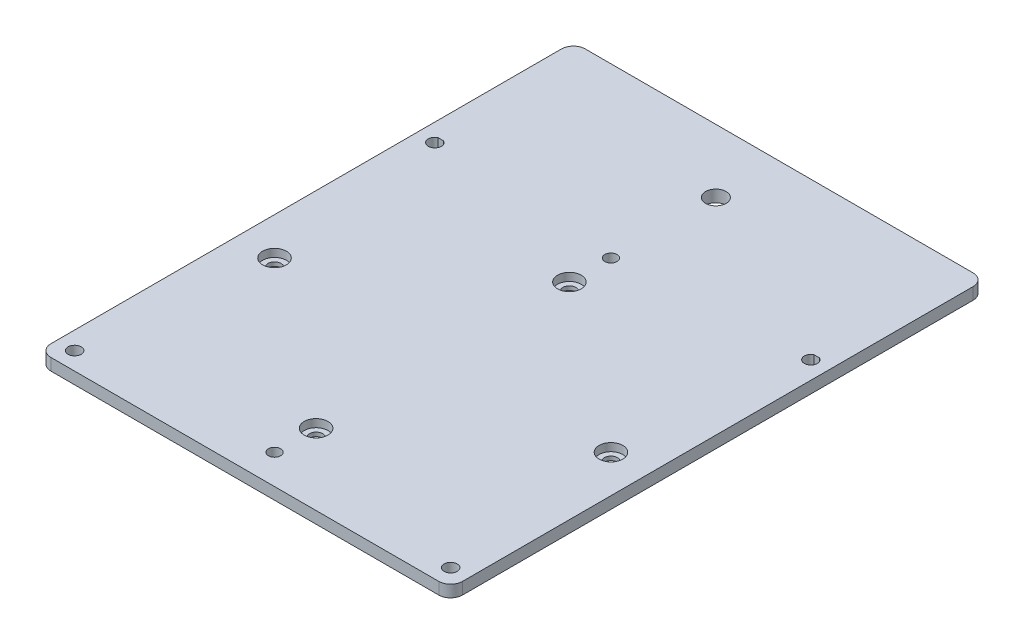
ISO-10303-21;
HEADER;
FILE_DESCRIPTION(('STEP AP214'),'2;1');
FILE_NAME('part.step','',(''),(''),'','','');
FILE_SCHEMA(('AUTOMOTIVE_DESIGN { 1 0 10303 214 1 1 1 1 }'));
ENDSEC;
DATA;
#1=APPLICATION_CONTEXT('core data for automotive mechanical design processes');
#2=APPLICATION_PROTOCOL_DEFINITION('international standard','automotive_design',2000,#1);
#3=PRODUCT_CONTEXT('',#1,'mechanical');
#4=PRODUCT('Part','Part','',(#3));
#5=PRODUCT_RELATED_PRODUCT_CATEGORY('part','',(#4));
#6=PRODUCT_DEFINITION_FORMATION('','',#4);
#7=PRODUCT_DEFINITION_CONTEXT('part definition',#1,'design');
#8=PRODUCT_DEFINITION('design','',#6,#7);
#9=PRODUCT_DEFINITION_SHAPE('','',#8);
#10=(LENGTH_UNIT() NAMED_UNIT(*) SI_UNIT(.MILLI.,.METRE.));
#11=(NAMED_UNIT(*) PLANE_ANGLE_UNIT() SI_UNIT($,.RADIAN.));
#12=(NAMED_UNIT(*) SI_UNIT($,.STERADIAN.) SOLID_ANGLE_UNIT());
#13=UNCERTAINTY_MEASURE_WITH_UNIT(LENGTH_MEASURE(1.E-05),#10,'distance_accuracy_value','');
#14=(GEOMETRIC_REPRESENTATION_CONTEXT(3) GLOBAL_UNCERTAINTY_ASSIGNED_CONTEXT((#13)) GLOBAL_UNIT_ASSIGNED_CONTEXT((#10,
#11,#12)) REPRESENTATION_CONTEXT('',''));
#15=CARTESIAN_POINT('',(0.,0.,0.));
#16=DIRECTION('',(0.,0.,1.));
#17=DIRECTION('',(1.,0.,0.));
#18=AXIS2_PLACEMENT_3D('',#15,#16,#17);
#19=CARTESIAN_POINT('',(0.,3.,100.));
#20=DIRECTION('',(-1.,0.,0.));
#21=DIRECTION('',(0.,0.,1.));
#22=AXIS2_PLACEMENT_3D('',#19,#20,#21);
#23=PLANE('',#22);
#24=DIRECTION('',(0.,0.,-1.));
#25=VECTOR('',#24,1.);
#26=CARTESIAN_POINT('',(0.,3.,100.));
#27=LINE('',#26,#25);
#28=CARTESIAN_POINT('',(0.,3.,97.));
#29=VERTEX_POINT('',#28);
#30=CARTESIAN_POINT('',(0.,3.,-32.));
#31=VERTEX_POINT('',#30);
#32=EDGE_CURVE('E172',#29,#31,#27,.T.);
#33=ORIENTED_EDGE('',*,*,#32,.T.);
#34=DIRECTION('',(0.,1.,0.));
#35=VECTOR('',#34,1.);
#36=CARTESIAN_POINT('',(0.,3.,-32.));
#37=LINE('',#36,#35);
#38=CARTESIAN_POINT('',(0.,0.,-32.));
#39=VERTEX_POINT('',#38);
#40=EDGE_CURVE('E11',#31,#39,#37,.F.);
#41=ORIENTED_EDGE('',*,*,#40,.T.);
#42=DIRECTION('',(0.,0.,-1.));
#43=VECTOR('',#42,1.);
#44=CARTESIAN_POINT('',(0.,0.,100.));
#45=LINE('',#44,#43);
#46=CARTESIAN_POINT('',(0.,0.,97.));
#47=VERTEX_POINT('',#46);
#48=EDGE_CURVE('E171',#47,#39,#45,.T.);
#49=ORIENTED_EDGE('',*,*,#48,.F.);
#50=DIRECTION('',(0.,-1.,0.));
#51=VECTOR('',#50,1.);
#52=CARTESIAN_POINT('',(0.,3.,97.));
#53=LINE('',#52,#51);
#54=EDGE_CURVE('E202',#47,#29,#53,.F.);
#55=ORIENTED_EDGE('',*,*,#54,.T.);
#56=EDGE_LOOP('',(#33,#41,#49,#55));
#57=FACE_BOUND('',#56,.T.);
#58=ADVANCED_FACE('F33',(#57),#23,.T.);
#59=CARTESIAN_POINT('',(104.,3.,100.));
#60=DIRECTION('',(0.,0.,1.));
#61=DIRECTION('',(1.,0.,0.));
#62=AXIS2_PLACEMENT_3D('',#59,#60,#61);
#63=PLANE('',#62);
#64=DIRECTION('',(-1.,0.,0.));
#65=VECTOR('',#64,1.);
#66=CARTESIAN_POINT('',(104.,0.,100.));
#67=LINE('',#66,#65);
#68=CARTESIAN_POINT('',(101.,0.,100.));
#69=VERTEX_POINT('',#68);
#70=CARTESIAN_POINT('',(3.00000000000004,0.,100.));
#71=VERTEX_POINT('',#70);
#72=EDGE_CURVE('E175',#69,#71,#67,.T.);
#73=ORIENTED_EDGE('',*,*,#72,.F.);
#74=DIRECTION('',(0.,-1.,0.));
#75=VECTOR('',#74,1.);
#76=CARTESIAN_POINT('',(101.,3.,100.));
#77=LINE('',#76,#75);
#78=CARTESIAN_POINT('',(101.,3.,100.));
#79=VERTEX_POINT('',#78);
#80=EDGE_CURVE('E200',#69,#79,#77,.F.);
#81=ORIENTED_EDGE('',*,*,#80,.T.);
#82=DIRECTION('',(-1.,0.,0.));
#83=VECTOR('',#82,1.);
#84=CARTESIAN_POINT('',(104.,3.,100.));
#85=LINE('',#84,#83);
#86=CARTESIAN_POINT('',(3.00000000000004,3.,100.));
#87=VERTEX_POINT('',#86);
#88=EDGE_CURVE('E177',#79,#87,#85,.T.);
#89=ORIENTED_EDGE('',*,*,#88,.T.);
#90=DIRECTION('',(0.,-1.,0.));
#91=VECTOR('',#90,1.);
#92=CARTESIAN_POINT('',(3.00000000000002,3.,100.));
#93=LINE('',#92,#91);
#94=EDGE_CURVE('E197',#87,#71,#93,.T.);
#95=ORIENTED_EDGE('',*,*,#94,.T.);
#96=EDGE_LOOP('',(#73,#81,#89,#95));
#97=FACE_BOUND('',#96,.T.);
#98=ADVANCED_FACE('F334',(#97),#63,.T.);
#99=CARTESIAN_POINT('',(104.,3.,0.));
#100=DIRECTION('',(1.,0.,0.));
#101=DIRECTION('',(0.,0.,-1.));
#102=AXIS2_PLACEMENT_3D('',#99,#100,#101);
#103=PLANE('',#102);
#104=DIRECTION('',(0.,0.,1.));
#105=VECTOR('',#104,1.);
#106=CARTESIAN_POINT('',(104.,0.,0.));
#107=LINE('',#106,#105);
#108=CARTESIAN_POINT('',(104.,0.,-32.));
#109=VERTEX_POINT('',#108);
#110=CARTESIAN_POINT('',(104.,0.,97.));
#111=VERTEX_POINT('',#110);
#112=EDGE_CURVE('E182',#109,#111,#107,.T.);
#113=ORIENTED_EDGE('',*,*,#112,.F.);
#114=DIRECTION('',(0.,1.,0.));
#115=VECTOR('',#114,1.);
#116=CARTESIAN_POINT('',(104.,3.,-32.));
#117=LINE('',#116,#115);
#118=CARTESIAN_POINT('',(104.,3.,-32.));
#119=VERTEX_POINT('',#118);
#120=EDGE_CURVE('E204',#109,#119,#117,.T.);
#121=ORIENTED_EDGE('',*,*,#120,.T.);
#122=DIRECTION('',(0.,0.,1.));
#123=VECTOR('',#122,1.);
#124=CARTESIAN_POINT('',(104.,3.,0.));
#125=LINE('',#124,#123);
#126=CARTESIAN_POINT('',(104.,3.,97.));
#127=VERTEX_POINT('',#126);
#128=EDGE_CURVE('E174',#119,#127,#125,.T.);
#129=ORIENTED_EDGE('',*,*,#128,.T.);
#130=DIRECTION('',(0.,-1.,0.));
#131=VECTOR('',#130,1.);
#132=CARTESIAN_POINT('',(104.,3.,97.));
#133=LINE('',#132,#131);
#134=EDGE_CURVE('E189',#127,#111,#133,.T.);
#135=ORIENTED_EDGE('',*,*,#134,.T.);
#136=EDGE_LOOP('',(#113,#121,#129,#135));
#137=FACE_BOUND('',#136,.T.);
#138=ADVANCED_FACE('F224',(#137),#103,.T.);
#139=CARTESIAN_POINT('',(0.,3.,0.));
#140=DIRECTION('',(0.,-1.,0.));
#141=DIRECTION('',(0.,0.,-1.));
#142=AXIS2_PLACEMENT_3D('',#139,#140,#141);
#143=PLANE('',#142);
#144=CARTESIAN_POINT('',(52.,3.,-19.));
#145=DIRECTION('',(0.,1.,0.));
#146=DIRECTION('',(0.,0.,1.));
#147=AXIS2_PLACEMENT_3D('',#144,#145,#146);
#148=CIRCLE('',#147,2.6);
#149=CARTESIAN_POINT('',(52.,3.,-16.4));
#150=VERTEX_POINT('',#149);
#151=EDGE_CURVE('E241',#150,#150,#148,.T.);
#152=ORIENTED_EDGE('',*,*,#151,.F.);
#153=EDGE_LOOP('',(#152));
#154=FACE_BOUND('',#153,.T.);
#155=DIRECTION('',(1.,0.,0.));
#156=VECTOR('',#155,1.);
#157=CARTESIAN_POINT('',(0.,3.,3.));
#158=LINE('',#157,#156);
#159=CARTESIAN_POINT('',(98.8126136457566,3.,3.));
#160=VERTEX_POINT('',#159);
#161=CARTESIAN_POINT('',(100.187386354243,3.,3.));
#162=VERTEX_POINT('',#161);
#163=EDGE_CURVE('E238',#160,#162,#158,.T.);
#164=ORIENTED_EDGE('',*,*,#163,.T.);
#165=CARTESIAN_POINT('',(99.5,3.,4.5));
#166=DIRECTION('',(0.,-1.,0.));
#167=DIRECTION('',(0.,0.,-1.));
#168=AXIS2_PLACEMENT_3D('',#165,#166,#167);
#169=CIRCLE('',#168,1.64999999999998);
#170=EDGE_CURVE('E156',#162,#160,#169,.T.);
#171=ORIENTED_EDGE('',*,*,#170,.T.);
#172=EDGE_LOOP('',(#164,#171));
#173=FACE_BOUND('',#172,.T.);
#174=CARTESIAN_POINT('',(3.81261364575665,3.,3.));
#175=VERTEX_POINT('',#174);
#176=CARTESIAN_POINT('',(5.18738635424335,3.,3.));
#177=VERTEX_POINT('',#176);
#178=EDGE_CURVE('E128',#175,#177,#158,.T.);
#179=ORIENTED_EDGE('',*,*,#178,.T.);
#180=CARTESIAN_POINT('',(4.5,3.,4.5));
#181=DIRECTION('',(0.,-1.,0.));
#182=DIRECTION('',(0.,0.,-1.));
#183=AXIS2_PLACEMENT_3D('',#180,#181,#182);
#184=CIRCLE('',#183,1.64999999999999);
#185=EDGE_CURVE('E144',#177,#175,#184,.T.);
#186=ORIENTED_EDGE('',*,*,#185,.T.);
#187=EDGE_LOOP('',(#179,#186));
#188=FACE_BOUND('',#187,.T.);
#189=CARTESIAN_POINT('',(52.,3.,7.5));
#190=DIRECTION('',(0.,1.,0.));
#191=DIRECTION('',(0.,0.,1.));
#192=AXIS2_PLACEMENT_3D('',#189,#190,#191);
#193=CIRCLE('',#192,1.55);
#194=CARTESIAN_POINT('',(52.,3.,9.05));
#195=VERTEX_POINT('',#194);
#196=EDGE_CURVE('E258',#195,#195,#193,.T.);
#197=ORIENTED_EDGE('',*,*,#196,.F.);
#198=EDGE_LOOP('',(#197));
#199=FACE_BOUND('',#198,.T.);
#200=CARTESIAN_POINT('',(52.,3.,92.5));
#201=DIRECTION('',(0.,1.,0.));
#202=DIRECTION('',(0.,0.,-1.));
#203=AXIS2_PLACEMENT_3D('',#200,#201,#202);
#204=CIRCLE('',#203,1.55);
#205=CARTESIAN_POINT('',(52.,3.,90.95));
#206=VERTEX_POINT('',#205);
#207=EDGE_CURVE('E253',#206,#206,#204,.T.);
#208=ORIENTED_EDGE('',*,*,#207,.F.);
#209=EDGE_LOOP('',(#208));
#210=FACE_BOUND('',#209,.T.);
#211=CARTESIAN_POINT('',(52.,3.,18.));
#212=DIRECTION('',(0.,1.,0.));
#213=DIRECTION('',(0.,0.,1.));
#214=AXIS2_PLACEMENT_3D('',#211,#212,#213);
#215=CIRCLE('',#214,3.);
#216=CARTESIAN_POINT('',(52.,3.,21.));
#217=VERTEX_POINT('',#216);
#218=EDGE_CURVE('E257',#217,#217,#215,.T.);
#219=ORIENTED_EDGE('',*,*,#218,.F.);
#220=EDGE_LOOP('',(#219));
#221=FACE_BOUND('',#220,.T.);
#222=CARTESIAN_POINT('',(94.5,3.,50.));
#223=DIRECTION('',(0.,1.,0.));
#224=DIRECTION('',(0.,0.,1.));
#225=AXIS2_PLACEMENT_3D('',#222,#223,#224);
#226=CIRCLE('',#225,2.99999999999999);
#227=CARTESIAN_POINT('',(94.5,3.,53.));
#228=VERTEX_POINT('',#227);
#229=EDGE_CURVE('E277',#228,#228,#226,.T.);
#230=ORIENTED_EDGE('',*,*,#229,.F.);
#231=EDGE_LOOP('',(#230));
#232=FACE_BOUND('',#231,.T.);
#233=CARTESIAN_POINT('',(9.5,3.,50.));
#234=DIRECTION('',(0.,1.,0.));
#235=DIRECTION('',(0.,0.,1.));
#236=AXIS2_PLACEMENT_3D('',#233,#234,#235);
#237=CIRCLE('',#236,2.99999999999999);
#238=CARTESIAN_POINT('',(9.5,3.,53.));
#239=VERTEX_POINT('',#238);
#240=EDGE_CURVE('E289',#239,#239,#237,.T.);
#241=ORIENTED_EDGE('',*,*,#240,.F.);
#242=EDGE_LOOP('',(#241));
#243=FACE_BOUND('',#242,.T.);
#244=CARTESIAN_POINT('',(52.,3.,82.));
#245=DIRECTION('',(0.,1.,0.));
#246=DIRECTION('',(0.,0.,1.));
#247=AXIS2_PLACEMENT_3D('',#244,#245,#246);
#248=CIRCLE('',#247,3.);
#249=CARTESIAN_POINT('',(52.,3.,85.));
#250=VERTEX_POINT('',#249);
#251=EDGE_CURVE('E301',#250,#250,#248,.T.);
#252=ORIENTED_EDGE('',*,*,#251,.F.);
#253=EDGE_LOOP('',(#252));
#254=FACE_BOUND('',#253,.T.);
#255=ORIENTED_EDGE('',*,*,#128,.F.);
#256=CARTESIAN_POINT('',(101.,3.,-32.));
#257=DIRECTION('',(0.,-1.,0.));
#258=DIRECTION('',(0.,0.,-1.));
#259=AXIS2_PLACEMENT_3D('',#256,#257,#258);
#260=CIRCLE('',#259,3.);
#261=CARTESIAN_POINT('',(101.,3.,-35.));
#262=VERTEX_POINT('',#261);
#263=EDGE_CURVE('E209',#119,#262,#260,.F.);
#264=ORIENTED_EDGE('',*,*,#263,.T.);
#265=DIRECTION('',(-1.,0.,0.));
#266=VECTOR('',#265,1.);
#267=CARTESIAN_POINT('',(0.,3.,-35.));
#268=LINE('',#267,#266);
#269=CARTESIAN_POINT('',(2.99999999999999,3.,-35.));
#270=VERTEX_POINT('',#269);
#271=EDGE_CURVE('E233',#262,#270,#268,.T.);
#272=ORIENTED_EDGE('',*,*,#271,.T.);
#273=CARTESIAN_POINT('',(3.,3.,-32.));
#274=DIRECTION('',(0.,-1.,0.));
#275=DIRECTION('',(0.,0.,-1.));
#276=AXIS2_PLACEMENT_3D('',#273,#274,#275);
#277=CIRCLE('',#276,3.);
#278=EDGE_CURVE('E207',#270,#31,#277,.F.);
#279=ORIENTED_EDGE('',*,*,#278,.T.);
#280=ORIENTED_EDGE('',*,*,#32,.F.);
#281=CARTESIAN_POINT('',(3.00000000000002,3.,97.));
#282=DIRECTION('',(0.,-1.,0.));
#283=DIRECTION('',(0.,0.,-1.));
#284=AXIS2_PLACEMENT_3D('',#281,#282,#283);
#285=CIRCLE('',#284,3.);
#286=EDGE_CURVE('E192',#29,#87,#285,.F.);
#287=ORIENTED_EDGE('',*,*,#286,.T.);
#288=ORIENTED_EDGE('',*,*,#88,.F.);
#289=CARTESIAN_POINT('',(101.,3.,97.));
#290=DIRECTION('',(0.,-1.,0.));
#291=DIRECTION('',(0.,0.,-1.));
#292=AXIS2_PLACEMENT_3D('',#289,#290,#291);
#293=CIRCLE('',#292,3.);
#294=EDGE_CURVE('E194',#79,#127,#293,.F.);
#295=ORIENTED_EDGE('',*,*,#294,.T.);
#296=EDGE_LOOP('',(#255,#264,#272,#279,#280,#287,#288,#295));
#297=FACE_BOUND('',#296,.T.);
#298=CARTESIAN_POINT('',(99.5,3.,95.5));
#299=DIRECTION('',(0.,-1.,0.));
#300=DIRECTION('',(0.,0.,-1.));
#301=AXIS2_PLACEMENT_3D('',#298,#299,#300);
#302=CIRCLE('',#301,1.64999999999998);
#303=CARTESIAN_POINT('',(99.5,3.,93.85));
#304=VERTEX_POINT('',#303);
#305=EDGE_CURVE('E162',#304,#304,#302,.T.);
#306=ORIENTED_EDGE('',*,*,#305,.T.);
#307=EDGE_LOOP('',(#306));
#308=FACE_BOUND('',#307,.T.);
#309=CARTESIAN_POINT('',(4.5,3.,95.5));
#310=DIRECTION('',(0.,-1.,0.));
#311=DIRECTION('',(0.,0.,-1.));
#312=AXIS2_PLACEMENT_3D('',#309,#310,#311);
#313=CIRCLE('',#312,1.64999999999999);
#314=CARTESIAN_POINT('',(4.5,3.,93.85));
#315=VERTEX_POINT('',#314);
#316=EDGE_CURVE('E168',#315,#315,#313,.T.);
#317=ORIENTED_EDGE('',*,*,#316,.T.);
#318=EDGE_LOOP('',(#317));
#319=FACE_BOUND('',#318,.T.);
#320=ADVANCED_FACE('F231',(#154,#173,#188,#199,#210,#221,#232,#243,#254,#297,#308,#319),#143,.F.);
#321=CARTESIAN_POINT('',(0.,0.,0.));
#322=DIRECTION('',(0.,-1.,0.));
#323=DIRECTION('',(0.,0.,-1.));
#324=AXIS2_PLACEMENT_3D('',#321,#322,#323);
#325=PLANE('',#324);
#326=CARTESIAN_POINT('',(52.,0.,-19.));
#327=DIRECTION('',(0.,1.,0.));
#328=DIRECTION('',(0.,0.,1.));
#329=AXIS2_PLACEMENT_3D('',#326,#327,#328);
#330=CIRCLE('',#329,2.6);
#331=CARTESIAN_POINT('',(52.,0.,-16.4));
#332=VERTEX_POINT('',#331);
#333=EDGE_CURVE('E244',#332,#332,#330,.T.);
#334=ORIENTED_EDGE('',*,*,#333,.T.);
#335=EDGE_LOOP('',(#334));
#336=FACE_BOUND('',#335,.T.);
#337=CARTESIAN_POINT('',(99.5,0.,4.5));
#338=DIRECTION('',(0.,-1.,0.));
#339=DIRECTION('',(0.,0.,-1.));
#340=AXIS2_PLACEMENT_3D('',#337,#338,#339);
#341=CIRCLE('',#340,1.64999999999998);
#342=CARTESIAN_POINT('',(100.187386354243,0.,3.));
#343=VERTEX_POINT('',#342);
#344=CARTESIAN_POINT('',(98.8126136457567,0.,3.));
#345=VERTEX_POINT('',#344);
#346=EDGE_CURVE('E147',#343,#345,#341,.T.);
#347=ORIENTED_EDGE('',*,*,#346,.F.);
#348=DIRECTION('',(1.,0.,0.));
#349=VECTOR('',#348,1.);
#350=CARTESIAN_POINT('',(0.,0.,3.));
#351=LINE('',#350,#349);
#352=EDGE_CURVE('E141',#345,#343,#351,.T.);
#353=ORIENTED_EDGE('',*,*,#352,.F.);
#354=EDGE_LOOP('',(#347,#353));
#355=FACE_BOUND('',#354,.T.);
#356=CARTESIAN_POINT('',(4.5,0.,4.5));
#357=DIRECTION('',(0.,-1.,0.));
#358=DIRECTION('',(0.,0.,-1.));
#359=AXIS2_PLACEMENT_3D('',#356,#357,#358);
#360=CIRCLE('',#359,1.64999999999999);
#361=CARTESIAN_POINT('',(5.18738635424335,0.,3.));
#362=VERTEX_POINT('',#361);
#363=CARTESIAN_POINT('',(3.81261364575665,0.,3.));
#364=VERTEX_POINT('',#363);
#365=EDGE_CURVE('E139',#362,#364,#360,.T.);
#366=ORIENTED_EDGE('',*,*,#365,.F.);
#367=EDGE_CURVE('E125',#364,#362,#351,.T.);
#368=ORIENTED_EDGE('',*,*,#367,.F.);
#369=EDGE_LOOP('',(#366,#368));
#370=FACE_BOUND('',#369,.T.);
#371=DIRECTION('',(-1.,0.,0.));
#372=VECTOR('',#371,1.);
#373=CARTESIAN_POINT('',(0.,0.,-35.));
#374=LINE('',#373,#372);
#375=CARTESIAN_POINT('',(101.,0.,-35.));
#376=VERTEX_POINT('',#375);
#377=CARTESIAN_POINT('',(3.,0.,-35.));
#378=VERTEX_POINT('',#377);
#379=EDGE_CURVE('E140',#376,#378,#374,.T.);
#380=ORIENTED_EDGE('',*,*,#379,.F.);
#381=CARTESIAN_POINT('',(101.,0.,-32.));
#382=DIRECTION('',(0.,-1.,0.));
#383=DIRECTION('',(0.,0.,-1.));
#384=AXIS2_PLACEMENT_3D('',#381,#382,#383);
#385=CIRCLE('',#384,3.);
#386=EDGE_CURVE('E41',#376,#109,#385,.T.);
#387=ORIENTED_EDGE('',*,*,#386,.T.);
#388=ORIENTED_EDGE('',*,*,#112,.T.);
#389=CARTESIAN_POINT('',(101.,0.,97.));
#390=DIRECTION('',(0.,-1.,0.));
#391=DIRECTION('',(0.,0.,-1.));
#392=AXIS2_PLACEMENT_3D('',#389,#390,#391);
#393=CIRCLE('',#392,3.);
#394=EDGE_CURVE('E187',#111,#69,#393,.T.);
#395=ORIENTED_EDGE('',*,*,#394,.T.);
#396=ORIENTED_EDGE('',*,*,#72,.T.);
#397=CARTESIAN_POINT('',(3.00000000000002,0.,97.));
#398=DIRECTION('',(0.,-1.,0.));
#399=DIRECTION('',(0.,0.,-1.));
#400=AXIS2_PLACEMENT_3D('',#397,#398,#399);
#401=CIRCLE('',#400,3.);
#402=EDGE_CURVE('E180',#71,#47,#401,.T.);
#403=ORIENTED_EDGE('',*,*,#402,.T.);
#404=ORIENTED_EDGE('',*,*,#48,.T.);
#405=CARTESIAN_POINT('',(3.,0.,-32.));
#406=DIRECTION('',(0.,-1.,0.));
#407=DIRECTION('',(0.,0.,-1.));
#408=AXIS2_PLACEMENT_3D('',#405,#406,#407);
#409=CIRCLE('',#408,3.);
#410=EDGE_CURVE('E53',#39,#378,#409,.T.);
#411=ORIENTED_EDGE('',*,*,#410,.T.);
#412=EDGE_LOOP('',(#380,#387,#388,#395,#396,#403,#404,#411));
#413=FACE_BOUND('',#412,.T.);
#414=CARTESIAN_POINT('',(52.,0.,7.5));
#415=DIRECTION('',(0.,1.,0.));
#416=DIRECTION('',(0.,0.,1.));
#417=AXIS2_PLACEMENT_3D('',#414,#415,#416);
#418=CIRCLE('',#417,1.55);
#419=CARTESIAN_POINT('',(52.,0.,9.05));
#420=VERTEX_POINT('',#419);
#421=EDGE_CURVE('E254',#420,#420,#418,.T.);
#422=ORIENTED_EDGE('',*,*,#421,.T.);
#423=EDGE_LOOP('',(#422));
#424=FACE_BOUND('',#423,.T.);
#425=CARTESIAN_POINT('',(52.,0.,92.5));
#426=DIRECTION('',(0.,1.,0.));
#427=DIRECTION('',(0.,0.,-1.));
#428=AXIS2_PLACEMENT_3D('',#425,#426,#427);
#429=CIRCLE('',#428,1.55);
#430=CARTESIAN_POINT('',(52.,0.,90.95));
#431=VERTEX_POINT('',#430);
#432=EDGE_CURVE('E261',#431,#431,#429,.T.);
#433=ORIENTED_EDGE('',*,*,#432,.T.);
#434=EDGE_LOOP('',(#433));
#435=FACE_BOUND('',#434,.T.);
#436=CARTESIAN_POINT('',(52.,0.,18.));
#437=DIRECTION('',(0.,1.,0.));
#438=DIRECTION('',(0.,0.,1.));
#439=AXIS2_PLACEMENT_3D('',#436,#437,#438);
#440=CIRCLE('',#439,1.65000000000001);
#441=CARTESIAN_POINT('',(52.,0.,19.65));
#442=VERTEX_POINT('',#441);
#443=EDGE_CURVE('E274',#442,#442,#440,.T.);
#444=ORIENTED_EDGE('',*,*,#443,.T.);
#445=EDGE_LOOP('',(#444));
#446=FACE_BOUND('',#445,.T.);
#447=CARTESIAN_POINT('',(94.5,0.,50.));
#448=DIRECTION('',(0.,1.,0.));
#449=DIRECTION('',(0.,0.,1.));
#450=AXIS2_PLACEMENT_3D('',#447,#448,#449);
#451=CIRCLE('',#450,1.65000000000001);
#452=CARTESIAN_POINT('',(94.5,0.,51.65));
#453=VERTEX_POINT('',#452);
#454=EDGE_CURVE('E286',#453,#453,#451,.T.);
#455=ORIENTED_EDGE('',*,*,#454,.T.);
#456=EDGE_LOOP('',(#455));
#457=FACE_BOUND('',#456,.T.);
#458=CARTESIAN_POINT('',(9.5,0.,50.));
#459=DIRECTION('',(0.,1.,0.));
#460=DIRECTION('',(0.,0.,1.));
#461=AXIS2_PLACEMENT_3D('',#458,#459,#460);
#462=CIRCLE('',#461,1.65000000000001);
#463=CARTESIAN_POINT('',(9.5,0.,51.65));
#464=VERTEX_POINT('',#463);
#465=EDGE_CURVE('E298',#464,#464,#462,.T.);
#466=ORIENTED_EDGE('',*,*,#465,.T.);
#467=EDGE_LOOP('',(#466));
#468=FACE_BOUND('',#467,.T.);
#469=CARTESIAN_POINT('',(52.,0.,82.));
#470=DIRECTION('',(0.,1.,0.));
#471=DIRECTION('',(0.,0.,1.));
#472=AXIS2_PLACEMENT_3D('',#469,#470,#471);
#473=CIRCLE('',#472,1.65000000000001);
#474=CARTESIAN_POINT('',(52.,0.,83.65));
#475=VERTEX_POINT('',#474);
#476=EDGE_CURVE('E145',#475,#475,#473,.T.);
#477=ORIENTED_EDGE('',*,*,#476,.T.);
#478=EDGE_LOOP('',(#477));
#479=FACE_BOUND('',#478,.T.);
#480=CARTESIAN_POINT('',(99.5,0.,95.5));
#481=DIRECTION('',(0.,-1.,0.));
#482=DIRECTION('',(0.,0.,-1.));
#483=AXIS2_PLACEMENT_3D('',#480,#481,#482);
#484=CIRCLE('',#483,1.64999999999998);
#485=CARTESIAN_POINT('',(99.5,0.,93.85));
#486=VERTEX_POINT('',#485);
#487=EDGE_CURVE('E159',#486,#486,#484,.T.);
#488=ORIENTED_EDGE('',*,*,#487,.F.);
#489=EDGE_LOOP('',(#488));
#490=FACE_BOUND('',#489,.T.);
#491=CARTESIAN_POINT('',(4.5,0.,95.5));
#492=DIRECTION('',(0.,-1.,0.));
#493=DIRECTION('',(0.,0.,-1.));
#494=AXIS2_PLACEMENT_3D('',#491,#492,#493);
#495=CIRCLE('',#494,1.64999999999999);
#496=CARTESIAN_POINT('',(4.5,0.,93.85));
#497=VERTEX_POINT('',#496);
#498=EDGE_CURVE('E165',#497,#497,#495,.T.);
#499=ORIENTED_EDGE('',*,*,#498,.F.);
#500=EDGE_LOOP('',(#499));
#501=FACE_BOUND('',#500,.T.);
#502=ADVANCED_FACE('F138',(#336,#355,#370,#413,#424,#435,#446,#457,#468,#479,#490,#501),#325,.T.);
#503=CARTESIAN_POINT('',(4.5,0.,95.5));
#504=DIRECTION('',(0.,-1.,0.));
#505=DIRECTION('',(0.,0.,-1.));
#506=AXIS2_PLACEMENT_3D('',#503,#504,#505);
#507=CYLINDRICAL_SURFACE('',#506,1.64999999999999);
#508=ORIENTED_EDGE('',*,*,#316,.F.);
#509=EDGE_LOOP('',(#508));
#510=FACE_BOUND('',#509,.T.);
#511=ORIENTED_EDGE('',*,*,#498,.T.);
#512=EDGE_LOOP('',(#511));
#513=FACE_BOUND('',#512,.T.);
#514=ADVANCED_FACE('F331',(#510,#513),#507,.F.);
#515=CARTESIAN_POINT('',(99.5,0.,95.5));
#516=DIRECTION('',(0.,-1.,0.));
#517=DIRECTION('',(0.,0.,-1.));
#518=AXIS2_PLACEMENT_3D('',#515,#516,#517);
#519=CYLINDRICAL_SURFACE('',#518,1.64999999999998);
#520=ORIENTED_EDGE('',*,*,#305,.F.);
#521=EDGE_LOOP('',(#520));
#522=FACE_BOUND('',#521,.T.);
#523=ORIENTED_EDGE('',*,*,#487,.T.);
#524=EDGE_LOOP('',(#523));
#525=FACE_BOUND('',#524,.T.);
#526=ADVANCED_FACE('F425',(#522,#525),#519,.F.);
#527=CARTESIAN_POINT('',(99.5,0.,4.5));
#528=DIRECTION('',(0.,-1.,0.));
#529=DIRECTION('',(0.,0.,-1.));
#530=AXIS2_PLACEMENT_3D('',#527,#528,#529);
#531=CYLINDRICAL_SURFACE('',#530,1.64999999999998);
#532=ORIENTED_EDGE('',*,*,#346,.T.);
#533=DIRECTION('',(0.,-1.,0.));
#534=VECTOR('',#533,1.);
#535=CARTESIAN_POINT('',(98.8126136457567,0.,3.));
#536=LINE('',#535,#534);
#537=EDGE_CURVE('E250',#345,#160,#536,.F.);
#538=ORIENTED_EDGE('',*,*,#537,.T.);
#539=ORIENTED_EDGE('',*,*,#170,.F.);
#540=DIRECTION('',(0.,-1.,0.));
#541=VECTOR('',#540,1.);
#542=CARTESIAN_POINT('',(100.187386354243,0.,3.));
#543=LINE('',#542,#541);
#544=EDGE_CURVE('E133',#162,#343,#543,.T.);
#545=ORIENTED_EDGE('',*,*,#544,.T.);
#546=EDGE_LOOP('',(#532,#538,#539,#545));
#547=FACE_BOUND('',#546,.T.);
#548=ADVANCED_FACE('F422',(#547),#531,.F.);
#549=CARTESIAN_POINT('',(4.5,0.,4.5));
#550=DIRECTION('',(0.,-1.,0.));
#551=DIRECTION('',(0.,0.,-1.));
#552=AXIS2_PLACEMENT_3D('',#549,#550,#551);
#553=CYLINDRICAL_SURFACE('',#552,1.64999999999999);
#554=ORIENTED_EDGE('',*,*,#365,.T.);
#555=DIRECTION('',(0.,-1.,0.));
#556=VECTOR('',#555,1.);
#557=CARTESIAN_POINT('',(3.81261364575665,0.,3.));
#558=LINE('',#557,#556);
#559=EDGE_CURVE('E122',#364,#175,#558,.F.);
#560=ORIENTED_EDGE('',*,*,#559,.T.);
#561=ORIENTED_EDGE('',*,*,#185,.F.);
#562=DIRECTION('',(0.,-1.,0.));
#563=VECTOR('',#562,1.);
#564=CARTESIAN_POINT('',(5.18738635424335,0.,3.));
#565=LINE('',#564,#563);
#566=EDGE_CURVE('E134',#177,#362,#565,.T.);
#567=ORIENTED_EDGE('',*,*,#566,.T.);
#568=EDGE_LOOP('',(#554,#560,#561,#567));
#569=FACE_BOUND('',#568,.T.);
#570=ADVANCED_FACE('F143',(#569),#553,.F.);
#571=CARTESIAN_POINT('',(52.,3.,82.));
#572=DIRECTION('',(0.,1.,0.));
#573=DIRECTION('',(0.,0.,1.));
#574=AXIS2_PLACEMENT_3D('',#571,#572,#573);
#575=CYLINDRICAL_SURFACE('',#574,1.65000000000001);
#576=ORIENTED_EDGE('',*,*,#476,.F.);
#577=EDGE_LOOP('',(#576));
#578=FACE_BOUND('',#577,.T.);
#579=CARTESIAN_POINT('',(52.,0.999999999999999,82.));
#580=DIRECTION('',(0.,1.,0.));
#581=DIRECTION('',(0.,0.,1.));
#582=AXIS2_PLACEMENT_3D('',#579,#580,#581);
#583=CIRCLE('',#582,1.65000000000001);
#584=CARTESIAN_POINT('',(52.,0.999999999999999,83.65));
#585=VERTEX_POINT('',#584);
#586=EDGE_CURVE('E150',#585,#585,#583,.T.);
#587=ORIENTED_EDGE('',*,*,#586,.T.);
#588=EDGE_LOOP('',(#587));
#589=FACE_BOUND('',#588,.T.);
#590=ADVANCED_FACE('F309',(#578,#589),#575,.F.);
#591=CARTESIAN_POINT('',(53.65,0.999999999999999,82.));
#592=DIRECTION('',(0.,-1.,0.));
#593=DIRECTION('',(0.,0.,-1.));
#594=AXIS2_PLACEMENT_3D('',#591,#592,#593);
#595=PLANE('',#594);
#596=ORIENTED_EDGE('',*,*,#586,.F.);
#597=EDGE_LOOP('',(#596));
#598=FACE_BOUND('',#597,.T.);
#599=CARTESIAN_POINT('',(52.,0.999999999999999,82.));
#600=DIRECTION('',(0.,1.,0.));
#601=DIRECTION('',(0.,0.,1.));
#602=AXIS2_PLACEMENT_3D('',#599,#600,#601);
#603=CIRCLE('',#602,3.);
#604=CARTESIAN_POINT('',(52.,0.999999999999999,85.));
#605=VERTEX_POINT('',#604);
#606=EDGE_CURVE('E304',#605,#605,#603,.T.);
#607=ORIENTED_EDGE('',*,*,#606,.T.);
#608=EDGE_LOOP('',(#607));
#609=FACE_BOUND('',#608,.T.);
#610=ADVANCED_FACE('F311',(#598,#609),#595,.F.);
#611=CARTESIAN_POINT('',(52.,3.,82.));
#612=DIRECTION('',(0.,1.,0.));
#613=DIRECTION('',(0.,0.,1.));
#614=AXIS2_PLACEMENT_3D('',#611,#612,#613);
#615=CYLINDRICAL_SURFACE('',#614,3.);
#616=ORIENTED_EDGE('',*,*,#606,.F.);
#617=EDGE_LOOP('',(#616));
#618=FACE_BOUND('',#617,.T.);
#619=ORIENTED_EDGE('',*,*,#251,.T.);
#620=EDGE_LOOP('',(#619));
#621=FACE_BOUND('',#620,.T.);
#622=ADVANCED_FACE('F314',(#618,#621),#615,.F.);
#623=CARTESIAN_POINT('',(9.5,3.,50.));
#624=DIRECTION('',(0.,1.,0.));
#625=DIRECTION('',(0.,0.,1.));
#626=AXIS2_PLACEMENT_3D('',#623,#624,#625);
#627=CYLINDRICAL_SURFACE('',#626,1.65000000000001);
#628=ORIENTED_EDGE('',*,*,#465,.F.);
#629=EDGE_LOOP('',(#628));
#630=FACE_BOUND('',#629,.T.);
#631=CARTESIAN_POINT('',(9.5,0.999999999999999,50.));
#632=DIRECTION('',(0.,1.,0.));
#633=DIRECTION('',(0.,0.,1.));
#634=AXIS2_PLACEMENT_3D('',#631,#632,#633);
#635=CIRCLE('',#634,1.65000000000001);
#636=CARTESIAN_POINT('',(9.5,0.999999999999999,51.65));
#637=VERTEX_POINT('',#636);
#638=EDGE_CURVE('E295',#637,#637,#635,.T.);
#639=ORIENTED_EDGE('',*,*,#638,.T.);
#640=EDGE_LOOP('',(#639));
#641=FACE_BOUND('',#640,.T.);
#642=ADVANCED_FACE('F320',(#630,#641),#627,.F.);
#643=CARTESIAN_POINT('',(11.15,0.999999999999999,50.));
#644=DIRECTION('',(0.,-1.,0.));
#645=DIRECTION('',(0.,0.,-1.));
#646=AXIS2_PLACEMENT_3D('',#643,#644,#645);
#647=PLANE('',#646);
#648=ORIENTED_EDGE('',*,*,#638,.F.);
#649=EDGE_LOOP('',(#648));
#650=FACE_BOUND('',#649,.T.);
#651=CARTESIAN_POINT('',(9.5,0.999999999999999,50.));
#652=DIRECTION('',(0.,1.,0.));
#653=DIRECTION('',(0.,0.,1.));
#654=AXIS2_PLACEMENT_3D('',#651,#652,#653);
#655=CIRCLE('',#654,2.99999999999999);
#656=CARTESIAN_POINT('',(9.5,0.999999999999999,53.));
#657=VERTEX_POINT('',#656);
#658=EDGE_CURVE('E292',#657,#657,#655,.T.);
#659=ORIENTED_EDGE('',*,*,#658,.T.);
#660=EDGE_LOOP('',(#659));
#661=FACE_BOUND('',#660,.T.);
#662=ADVANCED_FACE('F409',(#650,#661),#647,.F.);
#663=CARTESIAN_POINT('',(9.5,3.,50.));
#664=DIRECTION('',(0.,1.,0.));
#665=DIRECTION('',(0.,0.,1.));
#666=AXIS2_PLACEMENT_3D('',#663,#664,#665);
#667=CYLINDRICAL_SURFACE('',#666,2.99999999999999);
#668=ORIENTED_EDGE('',*,*,#658,.F.);
#669=EDGE_LOOP('',(#668));
#670=FACE_BOUND('',#669,.T.);
#671=ORIENTED_EDGE('',*,*,#240,.T.);
#672=EDGE_LOOP('',(#671));
#673=FACE_BOUND('',#672,.T.);
#674=ADVANCED_FACE('F405',(#670,#673),#667,.F.);
#675=CARTESIAN_POINT('',(94.5,3.,50.));
#676=DIRECTION('',(0.,1.,0.));
#677=DIRECTION('',(0.,0.,1.));
#678=AXIS2_PLACEMENT_3D('',#675,#676,#677);
#679=CYLINDRICAL_SURFACE('',#678,1.65000000000001);
#680=ORIENTED_EDGE('',*,*,#454,.F.);
#681=EDGE_LOOP('',(#680));
#682=FACE_BOUND('',#681,.T.);
#683=CARTESIAN_POINT('',(94.5,0.999999999999999,50.));
#684=DIRECTION('',(0.,1.,0.));
#685=DIRECTION('',(0.,0.,1.));
#686=AXIS2_PLACEMENT_3D('',#683,#684,#685);
#687=CIRCLE('',#686,1.65000000000001);
#688=CARTESIAN_POINT('',(94.5,0.999999999999999,51.65));
#689=VERTEX_POINT('',#688);
#690=EDGE_CURVE('E283',#689,#689,#687,.T.);
#691=ORIENTED_EDGE('',*,*,#690,.T.);
#692=EDGE_LOOP('',(#691));
#693=FACE_BOUND('',#692,.T.);
#694=ADVANCED_FACE('F401',(#682,#693),#679,.F.);
#695=CARTESIAN_POINT('',(96.15,0.999999999999999,50.));
#696=DIRECTION('',(0.,-1.,0.));
#697=DIRECTION('',(0.,0.,-1.));
#698=AXIS2_PLACEMENT_3D('',#695,#696,#697);
#699=PLANE('',#698);
#700=ORIENTED_EDGE('',*,*,#690,.F.);
#701=EDGE_LOOP('',(#700));
#702=FACE_BOUND('',#701,.T.);
#703=CARTESIAN_POINT('',(94.5,0.999999999999999,50.));
#704=DIRECTION('',(0.,1.,0.));
#705=DIRECTION('',(0.,0.,1.));
#706=AXIS2_PLACEMENT_3D('',#703,#704,#705);
#707=CIRCLE('',#706,2.99999999999999);
#708=CARTESIAN_POINT('',(94.5,0.999999999999999,53.));
#709=VERTEX_POINT('',#708);
#710=EDGE_CURVE('E280',#709,#709,#707,.T.);
#711=ORIENTED_EDGE('',*,*,#710,.T.);
#712=EDGE_LOOP('',(#711));
#713=FACE_BOUND('',#712,.T.);
#714=ADVANCED_FACE('F397',(#702,#713),#699,.F.);
#715=CARTESIAN_POINT('',(94.5,3.,50.));
#716=DIRECTION('',(0.,1.,0.));
#717=DIRECTION('',(0.,0.,1.));
#718=AXIS2_PLACEMENT_3D('',#715,#716,#717);
#719=CYLINDRICAL_SURFACE('',#718,2.99999999999999);
#720=ORIENTED_EDGE('',*,*,#710,.F.);
#721=EDGE_LOOP('',(#720));
#722=FACE_BOUND('',#721,.T.);
#723=ORIENTED_EDGE('',*,*,#229,.T.);
#724=EDGE_LOOP('',(#723));
#725=FACE_BOUND('',#724,.T.);
#726=ADVANCED_FACE('F393',(#722,#725),#719,.F.);
#727=CARTESIAN_POINT('',(52.,3.,18.));
#728=DIRECTION('',(0.,1.,0.));
#729=DIRECTION('',(0.,0.,1.));
#730=AXIS2_PLACEMENT_3D('',#727,#728,#729);
#731=CYLINDRICAL_SURFACE('',#730,1.65000000000001);
#732=ORIENTED_EDGE('',*,*,#443,.F.);
#733=EDGE_LOOP('',(#732));
#734=FACE_BOUND('',#733,.T.);
#735=CARTESIAN_POINT('',(52.,0.999999999999999,18.));
#736=DIRECTION('',(0.,1.,0.));
#737=DIRECTION('',(0.,0.,1.));
#738=AXIS2_PLACEMENT_3D('',#735,#736,#737);
#739=CIRCLE('',#738,1.65000000000001);
#740=CARTESIAN_POINT('',(52.,0.999999999999999,19.65));
#741=VERTEX_POINT('',#740);
#742=EDGE_CURVE('E271',#741,#741,#739,.T.);
#743=ORIENTED_EDGE('',*,*,#742,.T.);
#744=EDGE_LOOP('',(#743));
#745=FACE_BOUND('',#744,.T.);
#746=ADVANCED_FACE('F389',(#734,#745),#731,.F.);
#747=CARTESIAN_POINT('',(53.65,0.999999999999999,18.));
#748=DIRECTION('',(0.,-1.,0.));
#749=DIRECTION('',(0.,0.,-1.));
#750=AXIS2_PLACEMENT_3D('',#747,#748,#749);
#751=PLANE('',#750);
#752=ORIENTED_EDGE('',*,*,#742,.F.);
#753=EDGE_LOOP('',(#752));
#754=FACE_BOUND('',#753,.T.);
#755=CARTESIAN_POINT('',(52.,0.999999999999999,18.));
#756=DIRECTION('',(0.,1.,0.));
#757=DIRECTION('',(0.,0.,1.));
#758=AXIS2_PLACEMENT_3D('',#755,#756,#757);
#759=CIRCLE('',#758,3.);
#760=CARTESIAN_POINT('',(52.,0.999999999999999,21.));
#761=VERTEX_POINT('',#760);
#762=EDGE_CURVE('E268',#761,#761,#759,.T.);
#763=ORIENTED_EDGE('',*,*,#762,.T.);
#764=EDGE_LOOP('',(#763));
#765=FACE_BOUND('',#764,.T.);
#766=ADVANCED_FACE('F385',(#754,#765),#751,.F.);
#767=CARTESIAN_POINT('',(52.,3.,18.));
#768=DIRECTION('',(0.,1.,0.));
#769=DIRECTION('',(0.,0.,1.));
#770=AXIS2_PLACEMENT_3D('',#767,#768,#769);
#771=CYLINDRICAL_SURFACE('',#770,3.);
#772=ORIENTED_EDGE('',*,*,#762,.F.);
#773=EDGE_LOOP('',(#772));
#774=FACE_BOUND('',#773,.T.);
#775=ORIENTED_EDGE('',*,*,#218,.T.);
#776=EDGE_LOOP('',(#775));
#777=FACE_BOUND('',#776,.T.);
#778=ADVANCED_FACE('F351',(#774,#777),#771,.F.);
#779=CARTESIAN_POINT('',(101.,3.,97.));
#780=DIRECTION('',(0.,-1.,0.));
#781=DIRECTION('',(0.,0.,-1.));
#782=AXIS2_PLACEMENT_3D('',#779,#780,#781);
#783=CYLINDRICAL_SURFACE('',#782,3.);
#784=ORIENTED_EDGE('',*,*,#294,.F.);
#785=ORIENTED_EDGE('',*,*,#80,.F.);
#786=ORIENTED_EDGE('',*,*,#394,.F.);
#787=ORIENTED_EDGE('',*,*,#134,.F.);
#788=EDGE_LOOP('',(#784,#785,#786,#787));
#789=FACE_BOUND('',#788,.T.);
#790=ADVANCED_FACE('F347',(#789),#783,.T.);
#791=CARTESIAN_POINT('',(3.00000000000002,3.,97.));
#792=DIRECTION('',(0.,-1.,0.));
#793=DIRECTION('',(0.,0.,-1.));
#794=AXIS2_PLACEMENT_3D('',#791,#792,#793);
#795=CYLINDRICAL_SURFACE('',#794,3.);
#796=ORIENTED_EDGE('',*,*,#286,.F.);
#797=ORIENTED_EDGE('',*,*,#54,.F.);
#798=ORIENTED_EDGE('',*,*,#402,.F.);
#799=ORIENTED_EDGE('',*,*,#94,.F.);
#800=EDGE_LOOP('',(#796,#797,#798,#799));
#801=FACE_BOUND('',#800,.T.);
#802=ADVANCED_FACE('F350',(#801),#795,.T.);
#803=CARTESIAN_POINT('',(52.,0.,92.5));
#804=DIRECTION('',(0.,1.,0.));
#805=DIRECTION('',(0.,0.,1.));
#806=AXIS2_PLACEMENT_3D('',#803,#804,#805);
#807=CYLINDRICAL_SURFACE('',#806,1.55);
#808=ORIENTED_EDGE('',*,*,#432,.F.);
#809=EDGE_LOOP('',(#808));
#810=FACE_BOUND('',#809,.T.);
#811=ORIENTED_EDGE('',*,*,#207,.T.);
#812=EDGE_LOOP('',(#811));
#813=FACE_BOUND('',#812,.T.);
#814=ADVANCED_FACE('F354',(#810,#813),#807,.F.);
#815=CARTESIAN_POINT('',(52.,0.,7.5));
#816=DIRECTION('',(0.,1.,0.));
#817=DIRECTION('',(0.,0.,1.));
#818=AXIS2_PLACEMENT_3D('',#815,#816,#817);
#819=CYLINDRICAL_SURFACE('',#818,1.55);
#820=ORIENTED_EDGE('',*,*,#421,.F.);
#821=EDGE_LOOP('',(#820));
#822=FACE_BOUND('',#821,.T.);
#823=ORIENTED_EDGE('',*,*,#196,.T.);
#824=EDGE_LOOP('',(#823));
#825=FACE_BOUND('',#824,.T.);
#826=ADVANCED_FACE('F375',(#822,#825),#819,.F.);
#827=CARTESIAN_POINT('',(0.,-110.724884285331,-35.));
#828=DIRECTION('',(0.,0.,-1.));
#829=DIRECTION('',(-1.,0.,0.));
#830=AXIS2_PLACEMENT_3D('',#827,#828,#829);
#831=PLANE('',#830);
#832=ORIENTED_EDGE('',*,*,#271,.F.);
#833=DIRECTION('',(0.,1.,0.));
#834=VECTOR('',#833,1.);
#835=CARTESIAN_POINT('',(101.,-110.724884285331,-35.));
#836=LINE('',#835,#834);
#837=EDGE_CURVE('E214',#262,#376,#836,.F.);
#838=ORIENTED_EDGE('',*,*,#837,.T.);
#839=ORIENTED_EDGE('',*,*,#379,.T.);
#840=DIRECTION('',(0.,1.,0.));
#841=VECTOR('',#840,1.);
#842=CARTESIAN_POINT('',(3.,-110.724884285331,-35.));
#843=LINE('',#842,#841);
#844=EDGE_CURVE('E211',#378,#270,#843,.T.);
#845=ORIENTED_EDGE('',*,*,#844,.T.);
#846=EDGE_LOOP('',(#832,#838,#839,#845));
#847=FACE_BOUND('',#846,.T.);
#848=ADVANCED_FACE('F235',(#847),#831,.T.);
#849=CARTESIAN_POINT('',(0.,-110.724884285331,3.));
#850=DIRECTION('',(0.,0.,1.));
#851=DIRECTION('',(1.,0.,0.));
#852=AXIS2_PLACEMENT_3D('',#849,#850,#851);
#853=PLANE('',#852);
#854=ORIENTED_EDGE('',*,*,#559,.F.);
#855=ORIENTED_EDGE('',*,*,#367,.T.);
#856=ORIENTED_EDGE('',*,*,#566,.F.);
#857=ORIENTED_EDGE('',*,*,#178,.F.);
#858=EDGE_LOOP('',(#854,#855,#856,#857));
#859=FACE_BOUND('',#858,.T.);
#860=ADVANCED_FACE('F124',(#859),#853,.T.);
#861=ORIENTED_EDGE('',*,*,#537,.F.);
#862=ORIENTED_EDGE('',*,*,#352,.T.);
#863=ORIENTED_EDGE('',*,*,#544,.F.);
#864=ORIENTED_EDGE('',*,*,#163,.F.);
#865=EDGE_LOOP('',(#861,#862,#863,#864));
#866=FACE_BOUND('',#865,.T.);
#867=ADVANCED_FACE('F363',(#866),#853,.T.);
#868=CARTESIAN_POINT('',(52.,0.,-19.));
#869=DIRECTION('',(0.,1.,0.));
#870=DIRECTION('',(0.,0.,1.));
#871=AXIS2_PLACEMENT_3D('',#868,#869,#870);
#872=CYLINDRICAL_SURFACE('',#871,2.6);
#873=ORIENTED_EDGE('',*,*,#333,.F.);
#874=EDGE_LOOP('',(#873));
#875=FACE_BOUND('',#874,.T.);
#876=ORIENTED_EDGE('',*,*,#151,.T.);
#877=EDGE_LOOP('',(#876));
#878=FACE_BOUND('',#877,.T.);
#879=ADVANCED_FACE('F357',(#875,#878),#872,.F.);
#880=CARTESIAN_POINT('',(101.,3.,-32.));
#881=DIRECTION('',(0.,1.,0.));
#882=DIRECTION('',(0.,0.,1.));
#883=AXIS2_PLACEMENT_3D('',#880,#881,#882);
#884=CYLINDRICAL_SURFACE('',#883,3.);
#885=ORIENTED_EDGE('',*,*,#386,.F.);
#886=ORIENTED_EDGE('',*,*,#837,.F.);
#887=ORIENTED_EDGE('',*,*,#263,.F.);
#888=ORIENTED_EDGE('',*,*,#120,.F.);
#889=EDGE_LOOP('',(#885,#886,#887,#888));
#890=FACE_BOUND('',#889,.T.);
#891=ADVANCED_FACE('F227',(#890),#884,.T.);
#892=CARTESIAN_POINT('',(3.,-110.724884285331,-32.));
#893=DIRECTION('',(0.,1.,0.));
#894=DIRECTION('',(0.,0.,1.));
#895=AXIS2_PLACEMENT_3D('',#892,#893,#894);
#896=CYLINDRICAL_SURFACE('',#895,3.);
#897=ORIENTED_EDGE('',*,*,#410,.F.);
#898=ORIENTED_EDGE('',*,*,#40,.F.);
#899=ORIENTED_EDGE('',*,*,#278,.F.);
#900=ORIENTED_EDGE('',*,*,#844,.F.);
#901=EDGE_LOOP('',(#897,#898,#899,#900));
#902=FACE_BOUND('',#901,.T.);
#903=ADVANCED_FACE('F35',(#902),#896,.T.);
#904=CLOSED_SHELL('',(#58,#98,#138,#320,#502,#514,#526,#548,#570,#590,#610,#622,#642,#662,#674,
#694,#714,#726,#746,#766,#778,#790,#802,#814,#826,#848,#860,#867,#879,#891,#903));
#905=MANIFOLD_SOLID_BREP('B2',#904);
#906=ADVANCED_BREP_SHAPE_REPRESENTATION('',(#18,#905),#14);
#907=SHAPE_DEFINITION_REPRESENTATION(#9,#906);
ENDSEC;
END-ISO-10303-21;
